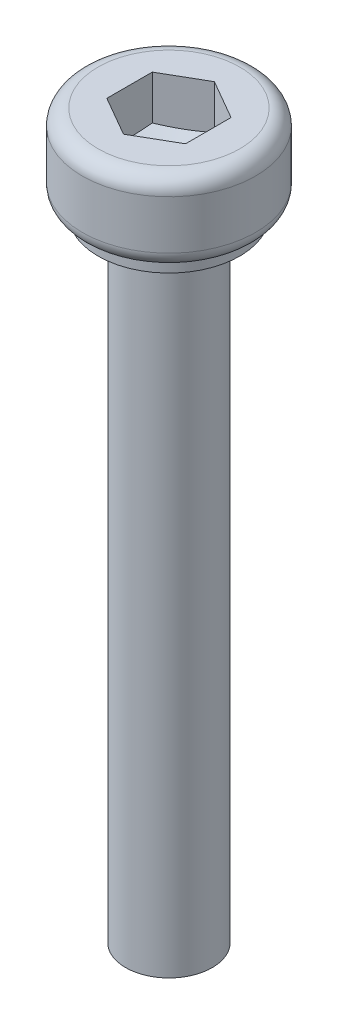
ISO-10303-21;
HEADER;
FILE_DESCRIPTION(('STEP AP214'),'2;1');
FILE_NAME('part.step','',(''),(''),'','','');
FILE_SCHEMA(('AUTOMOTIVE_DESIGN { 1 0 10303 214 1 1 1 1 }'));
ENDSEC;
DATA;
#1=APPLICATION_CONTEXT('core data for automotive mechanical design processes');
#2=APPLICATION_PROTOCOL_DEFINITION('international standard','automotive_design',2000,#1);
#3=PRODUCT_CONTEXT('',#1,'mechanical');
#4=PRODUCT('Part','Part','',(#3));
#5=PRODUCT_RELATED_PRODUCT_CATEGORY('part','',(#4));
#6=PRODUCT_DEFINITION_FORMATION('','',#4);
#7=PRODUCT_DEFINITION_CONTEXT('part definition',#1,'design');
#8=PRODUCT_DEFINITION('design','',#6,#7);
#9=PRODUCT_DEFINITION_SHAPE('','',#8);
#10=(LENGTH_UNIT() NAMED_UNIT(*) SI_UNIT(.MILLI.,.METRE.));
#11=(NAMED_UNIT(*) PLANE_ANGLE_UNIT() SI_UNIT($,.RADIAN.));
#12=(NAMED_UNIT(*) SI_UNIT($,.STERADIAN.) SOLID_ANGLE_UNIT());
#13=UNCERTAINTY_MEASURE_WITH_UNIT(LENGTH_MEASURE(1.E-05),#10,'distance_accuracy_value','');
#14=(GEOMETRIC_REPRESENTATION_CONTEXT(3) GLOBAL_UNCERTAINTY_ASSIGNED_CONTEXT((#13)) GLOBAL_UNIT_ASSIGNED_CONTEXT((#10,
#11,#12)) REPRESENTATION_CONTEXT('',''));
#15=CARTESIAN_POINT('',(0.,0.,0.));
#16=DIRECTION('',(0.,0.,1.));
#17=DIRECTION('',(1.,0.,0.));
#18=AXIS2_PLACEMENT_3D('',#15,#16,#17);
#19=CARTESIAN_POINT('',(0.,11.475,0.));
#20=DIRECTION('',(0.,-1.,0.));
#21=DIRECTION('',(0.,0.,-1.));
#22=AXIS2_PLACEMENT_3D('',#19,#20,#21);
#23=PLANE('',#22);
#24=DIRECTION('',(-0.866025403784439,0.,0.5));
#25=VECTOR('',#24,1.);
#26=CARTESIAN_POINT('',(0.,11.475,-1.44337567297406));
#27=LINE('',#26,#25);
#28=CARTESIAN_POINT('',(0.,11.475,-1.44337567297406));
#29=VERTEX_POINT('',#28);
#30=CARTESIAN_POINT('',(-1.25,11.475,-0.721687836487033));
#31=VERTEX_POINT('',#30);
#32=EDGE_CURVE('E205',#29,#31,#27,.T.);
#33=ORIENTED_EDGE('',*,*,#32,.F.);
#34=DIRECTION('',(-0.866025403784439,0.,-0.5));
#35=VECTOR('',#34,1.);
#36=CARTESIAN_POINT('',(1.25,11.475,-0.721687836487033));
#37=LINE('',#36,#35);
#38=CARTESIAN_POINT('',(1.25,11.475,-0.721687836487033));
#39=VERTEX_POINT('',#38);
#40=EDGE_CURVE('E60',#39,#29,#37,.T.);
#41=ORIENTED_EDGE('',*,*,#40,.F.);
#42=DIRECTION('',(0.,0.,-1.));
#43=VECTOR('',#42,1.);
#44=CARTESIAN_POINT('',(1.25,11.475,0.721687836487033));
#45=LINE('',#44,#43);
#46=CARTESIAN_POINT('',(1.25,11.475,0.721687836487033));
#47=VERTEX_POINT('',#46);
#48=EDGE_CURVE('E119',#47,#39,#45,.T.);
#49=ORIENTED_EDGE('',*,*,#48,.F.);
#50=DIRECTION('',(0.866025403784439,0.,-0.5));
#51=VECTOR('',#50,1.);
#52=CARTESIAN_POINT('',(0.,11.475,1.44337567297406));
#53=LINE('',#52,#51);
#54=CARTESIAN_POINT('',(0.,11.475,1.44337567297406));
#55=VERTEX_POINT('',#54);
#56=EDGE_CURVE('E124',#55,#47,#53,.T.);
#57=ORIENTED_EDGE('',*,*,#56,.F.);
#58=DIRECTION('',(0.866025403784439,0.,0.5));
#59=VECTOR('',#58,1.);
#60=CARTESIAN_POINT('',(-1.25,11.475,0.721687836487033));
#61=LINE('',#60,#59);
#62=CARTESIAN_POINT('',(-1.25,11.475,0.721687836487033));
#63=VERTEX_POINT('',#62);
#64=EDGE_CURVE('E372',#63,#55,#61,.T.);
#65=ORIENTED_EDGE('',*,*,#64,.F.);
#66=DIRECTION('',(0.,0.,1.));
#67=VECTOR('',#66,1.);
#68=CARTESIAN_POINT('',(-1.25,11.475,-0.721687836487033));
#69=LINE('',#68,#67);
#70=EDGE_CURVE('E380',#31,#63,#69,.T.);
#71=ORIENTED_EDGE('',*,*,#70,.F.);
#72=EDGE_LOOP('',(#33,#41,#49,#57,#65,#71));
#73=FACE_BOUND('',#72,.T.);
#74=CARTESIAN_POINT('',(0.,11.475,0.));
#75=DIRECTION('',(0.,1.,0.));
#76=DIRECTION('',(0.,0.,1.));
#77=AXIS2_PLACEMENT_3D('',#74,#75,#76);
#78=CIRCLE('',#77,2.25);
#79=CARTESIAN_POINT('',(0.,11.475,2.25));
#80=VERTEX_POINT('',#79);
#81=EDGE_CURVE('E11',#80,#80,#78,.T.);
#82=ORIENTED_EDGE('',*,*,#81,.T.);
#83=EDGE_LOOP('',(#82));
#84=FACE_BOUND('',#83,.T.);
#85=ADVANCED_FACE('F46',(#73,#84),#23,.F.);
#86=CARTESIAN_POINT('',(0.,10.975,0.));
#87=DIRECTION('',(0.,1.,0.));
#88=DIRECTION('',(0.,0.,1.));
#89=AXIS2_PLACEMENT_3D('',#86,#87,#88);
#90=TOROIDAL_SURFACE('',#89,2.25,0.499999999999999);
#91=ORIENTED_EDGE('',*,*,#81,.F.);
#92=EDGE_LOOP('',(#91));
#93=FACE_BOUND('',#92,.T.);
#94=CARTESIAN_POINT('',(0.,10.975,0.));
#95=DIRECTION('',(0.,1.,0.));
#96=DIRECTION('',(0.,0.,1.));
#97=AXIS2_PLACEMENT_3D('',#94,#95,#96);
#98=CIRCLE('',#97,2.75);
#99=CARTESIAN_POINT('',(0.,10.975,2.75));
#100=VERTEX_POINT('',#99);
#101=EDGE_CURVE('E53',#100,#100,#98,.T.);
#102=ORIENTED_EDGE('',*,*,#101,.T.);
#103=EDGE_LOOP('',(#102));
#104=FACE_BOUND('',#103,.T.);
#105=ADVANCED_FACE('F196',(#93,#104),#90,.T.);
#106=CARTESIAN_POINT('',(0.,4.09422492401216,0.));
#107=DIRECTION('',(0.,1.,0.));
#108=DIRECTION('',(0.,0.,1.));
#109=AXIS2_PLACEMENT_3D('',#106,#107,#108);
#110=CYLINDRICAL_SURFACE('',#109,2.75);
#111=ORIENTED_EDGE('',*,*,#101,.F.);
#112=EDGE_LOOP('',(#111));
#113=FACE_BOUND('',#112,.T.);
#114=CARTESIAN_POINT('',(0.,9.425,0.));
#115=DIRECTION('',(0.,1.,0.));
#116=DIRECTION('',(0.,0.,1.));
#117=AXIS2_PLACEMENT_3D('',#114,#115,#116);
#118=CIRCLE('',#117,2.75);
#119=CARTESIAN_POINT('',(0.,9.425,2.75));
#120=VERTEX_POINT('',#119);
#121=EDGE_CURVE('E211',#120,#120,#118,.T.);
#122=ORIENTED_EDGE('',*,*,#121,.T.);
#123=EDGE_LOOP('',(#122));
#124=FACE_BOUND('',#123,.T.);
#125=ADVANCED_FACE('F201',(#113,#124),#110,.T.);
#126=CARTESIAN_POINT('',(0.,9.425,0.));
#127=DIRECTION('',(0.,1.,0.));
#128=DIRECTION('',(0.,0.,1.));
#129=AXIS2_PLACEMENT_3D('',#126,#127,#128);
#130=TOROIDAL_SURFACE('',#129,2.25,0.5);
#131=ORIENTED_EDGE('',*,*,#121,.F.);
#132=EDGE_LOOP('',(#131));
#133=FACE_BOUND('',#132,.T.);
#134=CARTESIAN_POINT('',(0.,8.925,0.));
#135=DIRECTION('',(0.,1.,0.));
#136=DIRECTION('',(0.,0.,1.));
#137=AXIS2_PLACEMENT_3D('',#134,#135,#136);
#138=CIRCLE('',#137,2.25);
#139=CARTESIAN_POINT('',(0.,8.925,2.25));
#140=VERTEX_POINT('',#139);
#141=EDGE_CURVE('E213',#140,#140,#138,.T.);
#142=ORIENTED_EDGE('',*,*,#141,.T.);
#143=EDGE_LOOP('',(#142));
#144=FACE_BOUND('',#143,.T.);
#145=ADVANCED_FACE('F246',(#133,#144),#130,.T.);
#146=CARTESIAN_POINT('',(0.,4.09422492401216,0.));
#147=DIRECTION('',(0.,1.,0.));
#148=DIRECTION('',(0.,0.,1.));
#149=AXIS2_PLACEMENT_3D('',#146,#147,#148);
#150=CYLINDRICAL_SURFACE('',#149,2.25);
#151=ORIENTED_EDGE('',*,*,#141,.F.);
#152=EDGE_LOOP('',(#151));
#153=FACE_BOUND('',#152,.T.);
#154=CARTESIAN_POINT('',(0.,8.525,0.));
#155=DIRECTION('',(0.,1.,0.));
#156=DIRECTION('',(0.,0.,1.));
#157=AXIS2_PLACEMENT_3D('',#154,#155,#156);
#158=CIRCLE('',#157,2.25);
#159=CARTESIAN_POINT('',(0.,8.525,2.25));
#160=VERTEX_POINT('',#159);
#161=EDGE_CURVE('E218',#160,#160,#158,.T.);
#162=ORIENTED_EDGE('',*,*,#161,.T.);
#163=EDGE_LOOP('',(#162));
#164=FACE_BOUND('',#163,.T.);
#165=ADVANCED_FACE('F242',(#153,#164),#150,.T.);
#166=CARTESIAN_POINT('',(2.25,8.525,0.));
#167=DIRECTION('',(0.,1.,0.));
#168=DIRECTION('',(0.,0.,1.));
#169=AXIS2_PLACEMENT_3D('',#166,#167,#168);
#170=PLANE('',#169);
#171=ORIENTED_EDGE('',*,*,#161,.F.);
#172=EDGE_LOOP('',(#171));
#173=FACE_BOUND('',#172,.T.);
#174=CARTESIAN_POINT('',(0.,8.525,0.));
#175=DIRECTION('',(0.,1.,0.));
#176=DIRECTION('',(0.,0.,1.));
#177=AXIS2_PLACEMENT_3D('',#174,#175,#176);
#178=CIRCLE('',#177,1.375);
#179=CARTESIAN_POINT('',(0.,8.525,1.375));
#180=VERTEX_POINT('',#179);
#181=EDGE_CURVE('E220',#180,#180,#178,.T.);
#182=ORIENTED_EDGE('',*,*,#181,.T.);
#183=EDGE_LOOP('',(#182));
#184=FACE_BOUND('',#183,.T.);
#185=ADVANCED_FACE('F235',(#173,#184),#170,.F.);
#186=CARTESIAN_POINT('',(0.,4.09422492401216,0.));
#187=DIRECTION('',(0.,1.,0.));
#188=DIRECTION('',(0.,0.,1.));
#189=AXIS2_PLACEMENT_3D('',#186,#187,#188);
#190=CYLINDRICAL_SURFACE('',#189,1.375);
#191=ORIENTED_EDGE('',*,*,#181,.F.);
#192=EDGE_LOOP('',(#191));
#193=FACE_BOUND('',#192,.T.);
#194=CARTESIAN_POINT('',(0.,-11.475,0.));
#195=DIRECTION('',(0.,1.,0.));
#196=DIRECTION('',(0.,0.,1.));
#197=AXIS2_PLACEMENT_3D('',#194,#195,#196);
#198=CIRCLE('',#197,1.375);
#199=CARTESIAN_POINT('',(0.,-11.475,1.375));
#200=VERTEX_POINT('',#199);
#201=EDGE_CURVE('E107',#200,#200,#198,.T.);
#202=ORIENTED_EDGE('',*,*,#201,.T.);
#203=EDGE_LOOP('',(#202));
#204=FACE_BOUND('',#203,.T.);
#205=ADVANCED_FACE('F227',(#193,#204),#190,.T.);
#206=CARTESIAN_POINT('',(1.375,-11.475,0.));
#207=DIRECTION('',(0.,1.,0.));
#208=DIRECTION('',(0.,0.,1.));
#209=AXIS2_PLACEMENT_3D('',#206,#207,#208);
#210=PLANE('',#209);
#211=ORIENTED_EDGE('',*,*,#201,.F.);
#212=EDGE_LOOP('',(#211));
#213=FACE_BOUND('',#212,.T.);
#214=ADVANCED_FACE('F229',(#213),#210,.F.);
#215=CARTESIAN_POINT('',(1.25,9.475,-0.721687836487033));
#216=DIRECTION('',(0.5,0.,-0.866025403784439));
#217=DIRECTION('',(-0.866025403784439,0.,-0.5));
#218=AXIS2_PLACEMENT_3D('',#215,#216,#217);
#219=PLANE('',#218);
#220=CARTESIAN_POINT('',(-0.000199999999999668,10.0750221365922,-1.4434911430279));
#221=CARTESIAN_POINT('',(0.0518104295641313,10.0692624614358,-1.41346290751838));
#222=CARTESIAN_POINT('',(0.103869536937207,10.0640397472352,-1.38340656786277));
#223=CARTESIAN_POINT('',(0.208081999228773,10.0548712030317,-1.32323947470582));
#224=CARTESIAN_POINT('',(0.260235371100697,10.0509256318654,-1.29312871141642));
#225=CARTESIAN_POINT('',(0.364473709342653,10.0445253362828,-1.23294667877254));
#226=CARTESIAN_POINT('',(0.416558490077755,10.0420666841527,-1.20287551659445));
#227=CARTESIAN_POINT('',(0.520762183051685,10.0387704365246,-1.1427134864054));
#228=CARTESIAN_POINT('',(0.572881091525842,10.0379326851329,-1.11262262056797));
#229=CARTESIAN_POINT('',(0.677118908474158,10.0379326851329,-1.05244088889312));
#230=CARTESIAN_POINT('',(0.729237816948315,10.0387704365246,-1.0223500230557));
#231=CARTESIAN_POINT('',(0.833441509922245,10.0420666841527,-0.962187992866649));
#232=CARTESIAN_POINT('',(0.885526290657347,10.0445253362828,-0.932116830688555));
#233=CARTESIAN_POINT('',(0.989764628899302,10.0509256318654,-0.871934798044683));
#234=CARTESIAN_POINT('',(1.04191800077123,10.0548712030317,-0.84182403475528));
#235=CARTESIAN_POINT('',(1.14613046306279,10.0640397472352,-0.781656941598331));
#236=CARTESIAN_POINT('',(1.19818957043587,10.0692624614358,-0.751600601942714));
#237=CARTESIAN_POINT('',(1.2502,10.0750221365922,-0.721572366433195));
#238=B_SPLINE_CURVE_WITH_KNOTS('',3,(#220,#221,#222,#223,#224,#225,#226,#227,#228,#229,#230,
#231,#232,#233,#234,#235,#236,#237),.UNSPECIFIED.,.F.,.F.,(4,2,2,2,2,2,2,2,4),(0.,
0.181000745388271,0.362038150988404,0.542595231362164,0.723134945402974,0.903674659443784,
1.08423173981754,1.26526914541768,1.44626989080595),.UNSPECIFIED.);
#239=CARTESIAN_POINT('',(0.,10.075,-1.44337567297406));
#240=VERTEX_POINT('',#239);
#241=CARTESIAN_POINT('',(1.25,10.075,-0.721687836487033));
#242=VERTEX_POINT('',#241);
#243=EDGE_CURVE('E111',#240,#242,#238,.T.);
#244=ORIENTED_EDGE('',*,*,#243,.T.);
#245=DIRECTION('',(0.,1.,0.));
#246=VECTOR('',#245,1.);
#247=CARTESIAN_POINT('',(1.25,9.475,-0.721687836487033));
#248=LINE('',#247,#246);
#249=EDGE_CURVE('E108',#242,#39,#248,.T.);
#250=ORIENTED_EDGE('',*,*,#249,.T.);
#251=ORIENTED_EDGE('',*,*,#40,.T.);
#252=DIRECTION('',(0.,1.,0.));
#253=VECTOR('',#252,1.);
#254=CARTESIAN_POINT('',(0.,9.475,-1.44337567297406));
#255=LINE('',#254,#253);
#256=EDGE_CURVE('E103',#240,#29,#255,.T.);
#257=ORIENTED_EDGE('',*,*,#256,.F.);
#258=EDGE_LOOP('',(#244,#250,#251,#257));
#259=FACE_BOUND('',#258,.T.);
#260=ADVANCED_FACE('F118',(#259),#219,.F.);
#261=CARTESIAN_POINT('',(1.25,9.475,0.721687836487033));
#262=DIRECTION('',(1.,0.,0.));
#263=DIRECTION('',(0.,0.,-1.));
#264=AXIS2_PLACEMENT_3D('',#261,#262,#263);
#265=PLANE('',#264);
#266=CARTESIAN_POINT('',(1.25,10.2798639326607,-2.17905403611333));
#267=CARTESIAN_POINT('',(1.25,10.2624116742293,-2.07395009860659));
#268=CARTESIAN_POINT('',(1.25,10.2452203268198,-1.96879996781174));
#269=CARTESIAN_POINT('',(1.25,10.2117053182039,-1.75835059041696));
#270=CARTESIAN_POINT('',(1.25,10.1953817490476,-1.65305132920933));
#271=CARTESIAN_POINT('',(1.25,10.1638765163262,-1.44176294489903));
#272=CARTESIAN_POINT('',(1.25,10.1487007146126,-1.33577293769499));
#273=CARTESIAN_POINT('',(1.25,10.1201692854228,-1.12353979169022));
#274=CARTESIAN_POINT('',(1.25,10.1068137308094,-1.01729664292962));
#275=CARTESIAN_POINT('',(1.25,10.0829621391963,-0.806005172192659));
#276=CARTESIAN_POINT('',(1.25,10.0724282853726,-0.700961236680106));
#277=CARTESIAN_POINT('',(1.25,10.0550828738198,-0.49056779087624));
#278=CARTESIAN_POINT('',(1.25,10.0482707742986,-0.385218327307924));
#279=CARTESIAN_POINT('',(1.25,10.0394601051958,-0.174546490096706));
#280=CARTESIAN_POINT('',(1.25,10.0374505976255,-0.0692246022002213));
#281=CARTESIAN_POINT('',(1.25,10.0386143980744,0.141392413524251));
#282=CARTESIAN_POINT('',(1.25,10.0417878416773,0.246687540580118));
#283=CARTESIAN_POINT('',(1.25,10.0511996283626,0.428094047279166));
#284=CARTESIAN_POINT('',(1.25,10.0563547991909,0.504266022941004));
#285=CARTESIAN_POINT('',(1.25,10.0686418110161,0.656446776567252));
#286=CARTESIAN_POINT('',(1.25,10.0757736272437,0.732455556564639));
#287=CARTESIAN_POINT('',(1.25,10.0994952704236,0.960485133272157));
#288=CARTESIAN_POINT('',(1.25,10.1183956737701,1.11226253619117));
#289=CARTESIAN_POINT('',(1.25,10.1494952716597,1.34036100724888));
#290=CARTESIAN_POINT('',(1.25,10.1603850995588,1.41687238761891));
#291=CARTESIAN_POINT('',(1.25,10.1828607720028,1.56979468542723));
#292=CARTESIAN_POINT('',(1.25,10.1944466207317,1.64620560225877));
#293=CARTESIAN_POINT('',(1.25,10.2181092810802,1.7987279380359));
#294=CARTESIAN_POINT('',(1.25,10.2301846025663,1.87483959068598));
#295=CARTESIAN_POINT('',(1.25,10.254744859697,2.02699389967147));
#296=CARTESIAN_POINT('',(1.25,10.2672297796857,2.10303655853011));
#297=CARTESIAN_POINT('',(1.25,10.2798639326607,2.17905403611333));
#298=B_SPLINE_CURVE_WITH_KNOTS('',3,(#266,#267,#268,#269,#270,#271,#272,#273,#274,#275,#276,
#277,#278,#279,#280,#281,#282,#283,#284,#285,#286,#287,#288,#289,#290,#291,#292,#293,#294,#295,
#296,#297),.UNSPECIFIED.,.F.,.F.,(4,2,2,2,2,2,2,2,2,2,2,2,2,2,2,4),(0.,0.319633094293302,
0.639300026536297,0.960502494708347,1.28171781650624,1.59838422210634,1.91500451689018,
2.23090301324148,2.54680977350041,2.77582029179634,3.00482794049193,3.46358394927293,
3.69543178901939,3.92728102262634,4.15847082499727,4.38965180089788),.UNSPECIFIED.);
#299=CARTESIAN_POINT('',(1.25,10.075,0.721687836487033));
#300=VERTEX_POINT('',#299);
#301=EDGE_CURVE('E115',#242,#300,#298,.T.);
#302=ORIENTED_EDGE('',*,*,#301,.T.);
#303=DIRECTION('',(0.,1.,0.));
#304=VECTOR('',#303,1.);
#305=CARTESIAN_POINT('',(1.25,9.475,0.721687836487033));
#306=LINE('',#305,#304);
#307=EDGE_CURVE('E370',#300,#47,#306,.T.);
#308=ORIENTED_EDGE('',*,*,#307,.T.);
#309=ORIENTED_EDGE('',*,*,#48,.T.);
#310=ORIENTED_EDGE('',*,*,#249,.F.);
#311=EDGE_LOOP('',(#302,#308,#309,#310));
#312=FACE_BOUND('',#311,.T.);
#313=ADVANCED_FACE('F178',(#312),#265,.F.);
#314=CARTESIAN_POINT('',(0.,9.475,1.44337567297406));
#315=DIRECTION('',(0.5,0.,0.866025403784439));
#316=DIRECTION('',(0.866025403784439,0.,-0.5));
#317=AXIS2_PLACEMENT_3D('',#314,#315,#316);
#318=PLANE('',#317);
#319=CARTESIAN_POINT('',(1.2502,10.0750221365922,0.721572366433195));
#320=CARTESIAN_POINT('',(1.19818957043587,10.0692624614358,0.751600601942714));
#321=CARTESIAN_POINT('',(1.14613046306279,10.0640397472352,0.781656941598331));
#322=CARTESIAN_POINT('',(1.04191800077123,10.0548712030317,0.84182403475528));
#323=CARTESIAN_POINT('',(0.989764628899302,10.0509256318654,0.871934798044683));
#324=CARTESIAN_POINT('',(0.885526290657347,10.0445253362828,0.932116830688555));
#325=CARTESIAN_POINT('',(0.833441509922245,10.0420666841527,0.962187992866649));
#326=CARTESIAN_POINT('',(0.729237816948315,10.0387704365246,1.0223500230557));
#327=CARTESIAN_POINT('',(0.677118908474157,10.0379326851329,1.05244088889312));
#328=CARTESIAN_POINT('',(0.572881091525842,10.0379326851329,1.11262262056797));
#329=CARTESIAN_POINT('',(0.520762183051684,10.0387704365246,1.1427134864054));
#330=CARTESIAN_POINT('',(0.416558490077755,10.0420666841527,1.20287551659445));
#331=CARTESIAN_POINT('',(0.364473709342652,10.0445253362828,1.23294667877254));
#332=CARTESIAN_POINT('',(0.260235371100697,10.0509256318654,1.29312871141642));
#333=CARTESIAN_POINT('',(0.208081999228772,10.0548712030317,1.32323947470582));
#334=CARTESIAN_POINT('',(0.103869536937206,10.0640397472352,1.38340656786277));
#335=CARTESIAN_POINT('',(0.0518104295641308,10.0692624614358,1.41346290751838));
#336=CARTESIAN_POINT('',(-0.000200000000000338,10.0750221365922,1.4434911430279));
#337=B_SPLINE_CURVE_WITH_KNOTS('',3,(#319,#320,#321,#322,#323,#324,#325,#326,#327,#328,#329,
#330,#331,#332,#333,#334,#335,#336),.UNSPECIFIED.,.F.,.F.,(4,2,2,2,2,2,2,2,4),(0.,
0.181000745388271,0.362038150988404,0.542595231362164,0.723134945402974,0.903674659443785,
1.08423173981754,1.26526914541768,1.44626989080595),.UNSPECIFIED.);
#338=CARTESIAN_POINT('',(0.,10.075,1.44337567297406));
#339=VERTEX_POINT('',#338);
#340=EDGE_CURVE('E162',#300,#339,#337,.T.);
#341=ORIENTED_EDGE('',*,*,#340,.T.);
#342=DIRECTION('',(0.,1.,0.));
#343=VECTOR('',#342,1.);
#344=CARTESIAN_POINT('',(0.,9.475,1.44337567297406));
#345=LINE('',#344,#343);
#346=EDGE_CURVE('E368',#339,#55,#345,.T.);
#347=ORIENTED_EDGE('',*,*,#346,.T.);
#348=ORIENTED_EDGE('',*,*,#56,.T.);
#349=ORIENTED_EDGE('',*,*,#307,.F.);
#350=EDGE_LOOP('',(#341,#347,#348,#349));
#351=FACE_BOUND('',#350,.T.);
#352=ADVANCED_FACE('F181',(#351),#318,.F.);
#353=CARTESIAN_POINT('',(-1.25,9.475,0.721687836487033));
#354=DIRECTION('',(-0.5,0.,0.866025403784439));
#355=DIRECTION('',(0.866025403784439,0.,0.5));
#356=AXIS2_PLACEMENT_3D('',#353,#354,#355);
#357=PLANE('',#356);
#358=CARTESIAN_POINT('',(0.000199999999999786,10.0750221365922,1.4434911430279));
#359=CARTESIAN_POINT('',(-0.0518104295641314,10.0692624614358,1.41346290751838));
#360=CARTESIAN_POINT('',(-0.103869536937207,10.0640397472352,1.38340656786277));
#361=CARTESIAN_POINT('',(-0.208081999228772,10.0548712030317,1.32323947470582));
#362=CARTESIAN_POINT('',(-0.260235371100697,10.0509256318654,1.29312871141641));
#363=CARTESIAN_POINT('',(-0.364473709342653,10.0445253362828,1.23294667877254));
#364=CARTESIAN_POINT('',(-0.416558490077755,10.0420666841527,1.20287551659445));
#365=CARTESIAN_POINT('',(-0.520762183051685,10.0387704365246,1.1427134864054));
#366=CARTESIAN_POINT('',(-0.572881091525842,10.0379326851329,1.11262262056797));
#367=CARTESIAN_POINT('',(-0.677118908474158,10.0379326851329,1.05244088889312));
#368=CARTESIAN_POINT('',(-0.729237816948316,10.0387704365246,1.0223500230557));
#369=CARTESIAN_POINT('',(-0.833441509922245,10.0420666841527,0.962187992866648));
#370=CARTESIAN_POINT('',(-0.885526290657347,10.0445253362828,0.932116830688554));
#371=CARTESIAN_POINT('',(-0.989764628899303,10.0509256318654,0.871934798044682));
#372=CARTESIAN_POINT('',(-1.04191800077123,10.0548712030317,0.84182403475528));
#373=CARTESIAN_POINT('',(-1.14613046306279,10.0640397472352,0.781656941598331));
#374=CARTESIAN_POINT('',(-1.19818957043587,10.0692624614358,0.751600601942714));
#375=CARTESIAN_POINT('',(-1.2502,10.0750221365922,0.721572366433195));
#376=B_SPLINE_CURVE_WITH_KNOTS('',3,(#358,#359,#360,#361,#362,#363,#364,#365,#366,#367,#368,
#369,#370,#371,#372,#373,#374,#375),.UNSPECIFIED.,.F.,.F.,(4,2,2,2,2,2,2,2,4),(0.,
0.181000745388271,0.362038150988405,0.542595231362164,0.723134945402975,0.903674659443785,
1.08423173981754,1.26526914541768,1.44626989080595),.UNSPECIFIED.);
#377=CARTESIAN_POINT('',(-1.25,10.075,0.721687836487033));
#378=VERTEX_POINT('',#377);
#379=EDGE_CURVE('E155',#339,#378,#376,.T.);
#380=ORIENTED_EDGE('',*,*,#379,.T.);
#381=DIRECTION('',(0.,1.,0.));
#382=VECTOR('',#381,1.);
#383=CARTESIAN_POINT('',(-1.25,9.475,0.721687836487033));
#384=LINE('',#383,#382);
#385=EDGE_CURVE('E121',#378,#63,#384,.T.);
#386=ORIENTED_EDGE('',*,*,#385,.T.);
#387=ORIENTED_EDGE('',*,*,#64,.T.);
#388=ORIENTED_EDGE('',*,*,#346,.F.);
#389=EDGE_LOOP('',(#380,#386,#387,#388));
#390=FACE_BOUND('',#389,.T.);
#391=ADVANCED_FACE('F185',(#390),#357,.F.);
#392=CARTESIAN_POINT('',(-1.25,9.475,-0.721687836487033));
#393=DIRECTION('',(-1.,0.,0.));
#394=DIRECTION('',(0.,0.,1.));
#395=AXIS2_PLACEMENT_3D('',#392,#393,#394);
#396=PLANE('',#395);
#397=CARTESIAN_POINT('',(-1.25,10.2798639326607,2.17905403611333));
#398=CARTESIAN_POINT('',(-1.25,10.2624116742293,2.07395009860659));
#399=CARTESIAN_POINT('',(-1.25,10.2452203268198,1.96879996781174));
#400=CARTESIAN_POINT('',(-1.25,10.2117053182039,1.75835059041696));
#401=CARTESIAN_POINT('',(-1.25,10.1953817490476,1.65305132920933));
#402=CARTESIAN_POINT('',(-1.25,10.1638765163262,1.44176294489903));
#403=CARTESIAN_POINT('',(-1.25,10.1487007146126,1.33577293769499));
#404=CARTESIAN_POINT('',(-1.25,10.1201692854228,1.12353979169022));
#405=CARTESIAN_POINT('',(-1.25,10.1068137308094,1.01729664292962));
#406=CARTESIAN_POINT('',(-1.25,10.0829621391963,0.806005172192658));
#407=CARTESIAN_POINT('',(-1.25,10.0724282853726,0.700961236680106));
#408=CARTESIAN_POINT('',(-1.25,10.0550828738198,0.49056779087624));
#409=CARTESIAN_POINT('',(-1.25,10.0482707742986,0.385218327307924));
#410=CARTESIAN_POINT('',(-1.25,10.0394601051958,0.174546490096706));
#411=CARTESIAN_POINT('',(-1.25,10.0374505976255,0.069224602200221));
#412=CARTESIAN_POINT('',(-1.25,10.0386143980744,-0.141392413524251));
#413=CARTESIAN_POINT('',(-1.25,10.0417878416773,-0.246687540580118));
#414=CARTESIAN_POINT('',(-1.25,10.0511996283626,-0.428094047279167));
#415=CARTESIAN_POINT('',(-1.25,10.0563547991909,-0.504266022941004));
#416=CARTESIAN_POINT('',(-1.25,10.0686418110161,-0.656446776567251));
#417=CARTESIAN_POINT('',(-1.25,10.0757736272437,-0.732455556564639));
#418=CARTESIAN_POINT('',(-1.25,10.0994952704236,-0.960485133272157));
#419=CARTESIAN_POINT('',(-1.25,10.1183956737701,-1.11226253619117));
#420=CARTESIAN_POINT('',(-1.25,10.1494952716597,-1.34036100724888));
#421=CARTESIAN_POINT('',(-1.25,10.1603850995588,-1.41687238761891));
#422=CARTESIAN_POINT('',(-1.25,10.1828607720028,-1.56979468542723));
#423=CARTESIAN_POINT('',(-1.25,10.1944466207317,-1.64620560225877));
#424=CARTESIAN_POINT('',(-1.25,10.2181092810802,-1.7987279380359));
#425=CARTESIAN_POINT('',(-1.25,10.2301846025663,-1.87483959068598));
#426=CARTESIAN_POINT('',(-1.25,10.254744859697,-2.02699389967147));
#427=CARTESIAN_POINT('',(-1.25,10.2672297796857,-2.10303655853011));
#428=CARTESIAN_POINT('',(-1.25,10.2798639326607,-2.17905403611333));
#429=B_SPLINE_CURVE_WITH_KNOTS('',3,(#397,#398,#399,#400,#401,#402,#403,#404,#405,#406,#407,
#408,#409,#410,#411,#412,#413,#414,#415,#416,#417,#418,#419,#420,#421,#422,#423,#424,#425,#426,
#427,#428),.UNSPECIFIED.,.F.,.F.,(4,2,2,2,2,2,2,2,2,2,2,2,2,2,2,4),(0.,0.319633094293302,
0.639300026536297,0.960502494708347,1.28171781650624,1.59838422210634,1.91500451689018,
2.23090301324148,2.54680977350041,2.77582029179634,3.00482794049193,3.46358394927293,
3.69543178901939,3.92728102262634,4.15847082499727,4.38965180089788),.UNSPECIFIED.);
#430=CARTESIAN_POINT('',(-1.25,10.075,-0.721687836487033));
#431=VERTEX_POINT('',#430);
#432=EDGE_CURVE('E68',#378,#431,#429,.T.);
#433=ORIENTED_EDGE('',*,*,#432,.T.);
#434=DIRECTION('',(0.,1.,0.));
#435=VECTOR('',#434,1.);
#436=CARTESIAN_POINT('',(-1.25,9.475,-0.721687836487033));
#437=LINE('',#436,#435);
#438=EDGE_CURVE('E105',#431,#31,#437,.T.);
#439=ORIENTED_EDGE('',*,*,#438,.T.);
#440=ORIENTED_EDGE('',*,*,#70,.T.);
#441=ORIENTED_EDGE('',*,*,#385,.F.);
#442=EDGE_LOOP('',(#433,#439,#440,#441));
#443=FACE_BOUND('',#442,.T.);
#444=ADVANCED_FACE('F189',(#443),#396,.F.);
#445=CARTESIAN_POINT('',(0.,9.475,-1.44337567297406));
#446=DIRECTION('',(-0.5,0.,-0.866025403784439));
#447=DIRECTION('',(-0.866025403784439,0.,0.5));
#448=AXIS2_PLACEMENT_3D('',#445,#446,#447);
#449=PLANE('',#448);
#450=CARTESIAN_POINT('',(-1.2502,10.0750221365922,-0.721572366433195));
#451=CARTESIAN_POINT('',(-1.19818957043587,10.0692624614358,-0.751600601942714));
#452=CARTESIAN_POINT('',(-1.14613046306279,10.0640397472352,-0.781656941598331));
#453=CARTESIAN_POINT('',(-1.04191800077123,10.0548712030317,-0.84182403475528));
#454=CARTESIAN_POINT('',(-0.989764628899302,10.0509256318654,-0.871934798044683));
#455=CARTESIAN_POINT('',(-0.885526290657347,10.0445253362828,-0.932116830688555));
#456=CARTESIAN_POINT('',(-0.833441509922245,10.0420666841527,-0.962187992866649));
#457=CARTESIAN_POINT('',(-0.729237816948315,10.0387704365246,-1.0223500230557));
#458=CARTESIAN_POINT('',(-0.677118908474157,10.0379326851329,-1.05244088889312));
#459=CARTESIAN_POINT('',(-0.572881091525842,10.0379326851329,-1.11262262056797));
#460=CARTESIAN_POINT('',(-0.520762183051684,10.0387704365246,-1.1427134864054));
#461=CARTESIAN_POINT('',(-0.416558490077755,10.0420666841527,-1.20287551659445));
#462=CARTESIAN_POINT('',(-0.364473709342653,10.0445253362828,-1.23294667877254));
#463=CARTESIAN_POINT('',(-0.260235371100697,10.0509256318654,-1.29312871141641));
#464=CARTESIAN_POINT('',(-0.208081999228772,10.0548712030317,-1.32323947470582));
#465=CARTESIAN_POINT('',(-0.103869536937207,10.0640397472352,-1.38340656786277));
#466=CARTESIAN_POINT('',(-0.0518104295641308,10.0692624614358,-1.41346290751838));
#467=CARTESIAN_POINT('',(0.00020000000000028,10.0750221365922,-1.4434911430279));
#468=B_SPLINE_CURVE_WITH_KNOTS('',3,(#450,#451,#452,#453,#454,#455,#456,#457,#458,#459,#460,
#461,#462,#463,#464,#465,#466,#467),.UNSPECIFIED.,.F.,.F.,(4,2,2,2,2,2,2,2,4),(0.,
0.181000745388271,0.362038150988405,0.542595231362164,0.723134945402975,0.903674659443785,
1.08423173981754,1.26526914541768,1.44626989080595),.UNSPECIFIED.);
#469=EDGE_CURVE('E99',#431,#240,#468,.T.);
#470=ORIENTED_EDGE('',*,*,#469,.T.);
#471=ORIENTED_EDGE('',*,*,#256,.T.);
#472=ORIENTED_EDGE('',*,*,#32,.T.);
#473=ORIENTED_EDGE('',*,*,#438,.F.);
#474=EDGE_LOOP('',(#470,#471,#472,#473));
#475=FACE_BOUND('',#474,.T.);
#476=ADVANCED_FACE('F101',(#475),#449,.F.);
#477=CARTESIAN_POINT('',(0.,9.875,0.));
#478=DIRECTION('',(0.,1.,0.));
#479=DIRECTION('',(0.,0.,1.));
#480=AXIS2_PLACEMENT_3D('',#477,#478,#479);
#481=PLANE('',#480);
#482=CARTESIAN_POINT('',(0.,9.875,0.));
#483=DIRECTION('',(0.,-1.,0.));
#484=DIRECTION('',(0.,0.,-1.));
#485=AXIS2_PLACEMENT_3D('',#482,#483,#484);
#486=CIRCLE('',#485,0.4);
#487=CARTESIAN_POINT('',(0.,9.875,-0.4));
#488=VERTEX_POINT('',#487);
#489=EDGE_CURVE('E363',#488,#488,#486,.T.);
#490=ORIENTED_EDGE('',*,*,#489,.F.);
#491=EDGE_LOOP('',(#490));
#492=FACE_BOUND('',#491,.T.);
#493=ADVANCED_FACE('F141',(#492),#481,.T.);
#494=CARTESIAN_POINT('',(0.,10.075,0.));
#495=DIRECTION('',(0.,1.,0.));
#496=DIRECTION('',(0.,0.,1.));
#497=AXIS2_PLACEMENT_3D('',#494,#495,#496);
#498=CONICAL_SURFACE('',#497,1.44337567297406,1.38140809939809);
#499=ORIENTED_EDGE('',*,*,#243,.F.);
#500=ORIENTED_EDGE('',*,*,#469,.F.);
#501=ORIENTED_EDGE('',*,*,#432,.F.);
#502=ORIENTED_EDGE('',*,*,#379,.F.);
#503=ORIENTED_EDGE('',*,*,#340,.F.);
#504=ORIENTED_EDGE('',*,*,#301,.F.);
#505=EDGE_LOOP('',(#499,#500,#501,#502,#503,#504));
#506=FACE_BOUND('',#505,.T.);
#507=ORIENTED_EDGE('',*,*,#489,.T.);
#508=EDGE_LOOP('',(#507));
#509=FACE_BOUND('',#508,.T.);
#510=ADVANCED_FACE('F112',(#506,#509),#498,.F.);
#511=CLOSED_SHELL('',(#85,#105,#125,#145,#165,#185,#205,#214,#260,#313,#352,#391,#444,#476,#493,#510));
#512=MANIFOLD_SOLID_BREP('B2',#511);
#513=ADVANCED_BREP_SHAPE_REPRESENTATION('',(#18,#512),#14);
#514=SHAPE_DEFINITION_REPRESENTATION(#9,#513);
ENDSEC;
END-ISO-10303-21;
